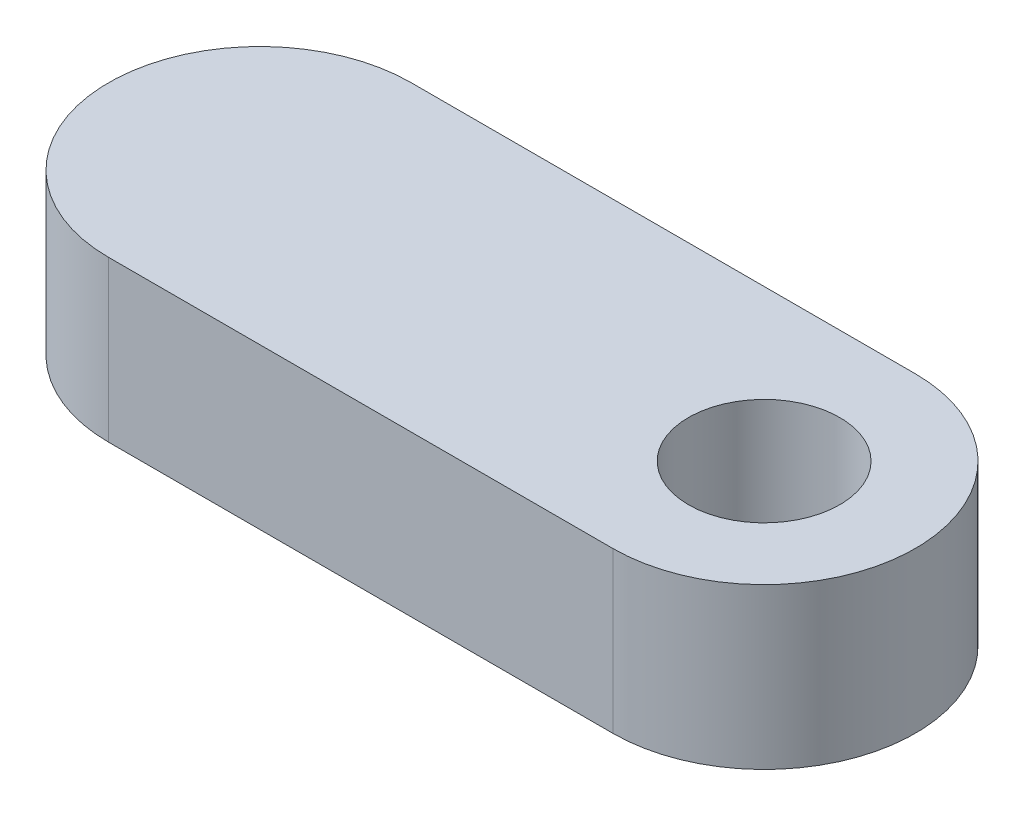
ISO-10303-21;
HEADER;
FILE_DESCRIPTION(('STEP AP214'),'2;1');
FILE_NAME('part.step','',(''),(''),'','','');
FILE_SCHEMA(('AUTOMOTIVE_DESIGN { 1 0 10303 214 1 1 1 1 }'));
ENDSEC;
DATA;
#1=APPLICATION_CONTEXT('core data for automotive mechanical design processes');
#2=APPLICATION_PROTOCOL_DEFINITION('international standard','automotive_design',2000,#1);
#3=PRODUCT_CONTEXT('',#1,'mechanical');
#4=PRODUCT('Part','Part','',(#3));
#5=PRODUCT_RELATED_PRODUCT_CATEGORY('part','',(#4));
#6=PRODUCT_DEFINITION_FORMATION('','',#4);
#7=PRODUCT_DEFINITION_CONTEXT('part definition',#1,'design');
#8=PRODUCT_DEFINITION('design','',#6,#7);
#9=PRODUCT_DEFINITION_SHAPE('','',#8);
#10=(LENGTH_UNIT() NAMED_UNIT(*) SI_UNIT(.MILLI.,.METRE.));
#11=(NAMED_UNIT(*) PLANE_ANGLE_UNIT() SI_UNIT($,.RADIAN.));
#12=(NAMED_UNIT(*) SI_UNIT($,.STERADIAN.) SOLID_ANGLE_UNIT());
#13=UNCERTAINTY_MEASURE_WITH_UNIT(LENGTH_MEASURE(1.E-05),#10,'distance_accuracy_value','');
#14=(GEOMETRIC_REPRESENTATION_CONTEXT(3) GLOBAL_UNCERTAINTY_ASSIGNED_CONTEXT((#13)) GLOBAL_UNIT_ASSIGNED_CONTEXT((#10,
#11,#12)) REPRESENTATION_CONTEXT('',''));
#15=CARTESIAN_POINT('',(0.,0.,0.));
#16=DIRECTION('',(0.,0.,1.));
#17=DIRECTION('',(1.,0.,0.));
#18=AXIS2_PLACEMENT_3D('',#15,#16,#17);
#19=CARTESIAN_POINT('',(-5.,3.175,0.));
#20=DIRECTION('',(0.,1.,0.));
#21=DIRECTION('',(0.,0.,1.));
#22=AXIS2_PLACEMENT_3D('',#19,#20,#21);
#23=PLANE('',#22);
#24=CARTESIAN_POINT('',(-5.,3.175,0.));
#25=DIRECTION('',(0.,1.,0.));
#26=DIRECTION('',(0.,0.,1.));
#27=AXIS2_PLACEMENT_3D('',#24,#25,#26);
#28=CIRCLE('',#27,3.);
#29=CARTESIAN_POINT('',(-5.,3.175,-3.));
#30=VERTEX_POINT('',#29);
#31=CARTESIAN_POINT('',(-5.,3.175,3.));
#32=VERTEX_POINT('',#31);
#33=EDGE_CURVE('E86',#30,#32,#28,.T.);
#34=ORIENTED_EDGE('',*,*,#33,.T.);
#35=DIRECTION('',(1.,0.,0.));
#36=VECTOR('',#35,1.);
#37=CARTESIAN_POINT('',(5.,3.175,3.));
#38=LINE('',#37,#36);
#39=CARTESIAN_POINT('',(5.,3.175,3.));
#40=VERTEX_POINT('',#39);
#41=EDGE_CURVE('E81',#32,#40,#38,.T.);
#42=ORIENTED_EDGE('',*,*,#41,.T.);
#43=CARTESIAN_POINT('',(5.,3.175,0.));
#44=DIRECTION('',(0.,1.,0.));
#45=DIRECTION('',(0.,0.,-1.));
#46=AXIS2_PLACEMENT_3D('',#43,#44,#45);
#47=CIRCLE('',#46,3.);
#48=CARTESIAN_POINT('',(5.,3.175,-3.));
#49=VERTEX_POINT('',#48);
#50=EDGE_CURVE('E84',#40,#49,#47,.T.);
#51=ORIENTED_EDGE('',*,*,#50,.T.);
#52=DIRECTION('',(-1.,0.,0.));
#53=VECTOR('',#52,1.);
#54=CARTESIAN_POINT('',(-5.,3.175,-3.));
#55=LINE('',#54,#53);
#56=EDGE_CURVE('E51',#49,#30,#55,.T.);
#57=ORIENTED_EDGE('',*,*,#56,.T.);
#58=EDGE_LOOP('',(#34,#42,#51,#57));
#59=FACE_BOUND('',#58,.T.);
#60=CARTESIAN_POINT('',(5.,3.175,0.));
#61=DIRECTION('',(0.,1.,0.));
#62=DIRECTION('',(0.,0.,1.));
#63=AXIS2_PLACEMENT_3D('',#60,#61,#62);
#64=CIRCLE('',#63,1.5);
#65=CARTESIAN_POINT('',(5.,3.175,1.5));
#66=VERTEX_POINT('',#65);
#67=EDGE_CURVE('E101',#66,#66,#64,.T.);
#68=ORIENTED_EDGE('',*,*,#67,.F.);
#69=EDGE_LOOP('',(#68));
#70=FACE_BOUND('',#69,.T.);
#71=ADVANCED_FACE('F34',(#59,#70),#23,.T.);
#72=CARTESIAN_POINT('',(-5.,0.,0.));
#73=DIRECTION('',(0.,1.,0.));
#74=DIRECTION('',(0.,0.,1.));
#75=AXIS2_PLACEMENT_3D('',#72,#73,#74);
#76=PLANE('',#75);
#77=CARTESIAN_POINT('',(-5.,0.,0.));
#78=DIRECTION('',(0.,1.,0.));
#79=DIRECTION('',(0.,0.,1.));
#80=AXIS2_PLACEMENT_3D('',#77,#78,#79);
#81=CIRCLE('',#80,3.);
#82=CARTESIAN_POINT('',(-5.,0.,-3.));
#83=VERTEX_POINT('',#82);
#84=CARTESIAN_POINT('',(-5.,0.,3.));
#85=VERTEX_POINT('',#84);
#86=EDGE_CURVE('E98',#83,#85,#81,.T.);
#87=ORIENTED_EDGE('',*,*,#86,.F.);
#88=DIRECTION('',(-1.,0.,0.));
#89=VECTOR('',#88,1.);
#90=CARTESIAN_POINT('',(-5.,0.,-3.));
#91=LINE('',#90,#89);
#92=CARTESIAN_POINT('',(5.,0.,-3.));
#93=VERTEX_POINT('',#92);
#94=EDGE_CURVE('E74',#93,#83,#91,.T.);
#95=ORIENTED_EDGE('',*,*,#94,.F.);
#96=CARTESIAN_POINT('',(5.,0.,0.));
#97=DIRECTION('',(0.,1.,0.));
#98=DIRECTION('',(0.,0.,-1.));
#99=AXIS2_PLACEMENT_3D('',#96,#97,#98);
#100=CIRCLE('',#99,3.);
#101=CARTESIAN_POINT('',(5.,0.,3.));
#102=VERTEX_POINT('',#101);
#103=EDGE_CURVE('E68',#102,#93,#100,.T.);
#104=ORIENTED_EDGE('',*,*,#103,.F.);
#105=DIRECTION('',(1.,0.,0.));
#106=VECTOR('',#105,1.);
#107=CARTESIAN_POINT('',(5.,0.,3.));
#108=LINE('',#107,#106);
#109=EDGE_CURVE('E90',#85,#102,#108,.T.);
#110=ORIENTED_EDGE('',*,*,#109,.F.);
#111=EDGE_LOOP('',(#87,#95,#104,#110));
#112=FACE_BOUND('',#111,.T.);
#113=CARTESIAN_POINT('',(5.,0.,0.));
#114=DIRECTION('',(0.,1.,0.));
#115=DIRECTION('',(0.,0.,1.));
#116=AXIS2_PLACEMENT_3D('',#113,#114,#115);
#117=CIRCLE('',#116,1.5);
#118=CARTESIAN_POINT('',(5.,0.,1.5));
#119=VERTEX_POINT('',#118);
#120=EDGE_CURVE('E113',#119,#119,#117,.T.);
#121=ORIENTED_EDGE('',*,*,#120,.T.);
#122=EDGE_LOOP('',(#121));
#123=FACE_BOUND('',#122,.T.);
#124=ADVANCED_FACE('F109',(#112,#123),#76,.F.);
#125=CARTESIAN_POINT('',(-5.,3.175,0.));
#126=DIRECTION('',(0.,-1.,0.));
#127=DIRECTION('',(0.,0.,-1.));
#128=AXIS2_PLACEMENT_3D('',#125,#126,#127);
#129=CYLINDRICAL_SURFACE('',#128,3.);
#130=ORIENTED_EDGE('',*,*,#86,.T.);
#131=DIRECTION('',(0.,-1.,0.));
#132=VECTOR('',#131,1.);
#133=CARTESIAN_POINT('',(-5.,3.175,3.));
#134=LINE('',#133,#132);
#135=EDGE_CURVE('E11',#32,#85,#134,.T.);
#136=ORIENTED_EDGE('',*,*,#135,.F.);
#137=ORIENTED_EDGE('',*,*,#33,.F.);
#138=DIRECTION('',(0.,-1.,0.));
#139=VECTOR('',#138,1.);
#140=CARTESIAN_POINT('',(-5.,3.175,-3.));
#141=LINE('',#140,#139);
#142=EDGE_CURVE('E94',#30,#83,#141,.T.);
#143=ORIENTED_EDGE('',*,*,#142,.T.);
#144=EDGE_LOOP('',(#130,#136,#137,#143));
#145=FACE_BOUND('',#144,.T.);
#146=ADVANCED_FACE('F36',(#145),#129,.T.);
#147=CARTESIAN_POINT('',(5.,3.175,3.));
#148=DIRECTION('',(0.,0.,-1.));
#149=DIRECTION('',(-1.,0.,0.));
#150=AXIS2_PLACEMENT_3D('',#147,#148,#149);
#151=PLANE('',#150);
#152=ORIENTED_EDGE('',*,*,#109,.T.);
#153=DIRECTION('',(0.,-1.,0.));
#154=VECTOR('',#153,1.);
#155=CARTESIAN_POINT('',(5.,3.175,3.));
#156=LINE('',#155,#154);
#157=EDGE_CURVE('E43',#40,#102,#156,.T.);
#158=ORIENTED_EDGE('',*,*,#157,.F.);
#159=ORIENTED_EDGE('',*,*,#41,.F.);
#160=ORIENTED_EDGE('',*,*,#135,.T.);
#161=EDGE_LOOP('',(#152,#158,#159,#160));
#162=FACE_BOUND('',#161,.T.);
#163=ADVANCED_FACE('F89',(#162),#151,.F.);
#164=CARTESIAN_POINT('',(5.,3.175,0.));
#165=DIRECTION('',(0.,-1.,0.));
#166=DIRECTION('',(0.,0.,-1.));
#167=AXIS2_PLACEMENT_3D('',#164,#165,#166);
#168=CYLINDRICAL_SURFACE('',#167,3.);
#169=ORIENTED_EDGE('',*,*,#103,.T.);
#170=DIRECTION('',(0.,-1.,0.));
#171=VECTOR('',#170,1.);
#172=CARTESIAN_POINT('',(5.,3.175,-3.));
#173=LINE('',#172,#171);
#174=EDGE_CURVE('E91',#49,#93,#173,.T.);
#175=ORIENTED_EDGE('',*,*,#174,.F.);
#176=ORIENTED_EDGE('',*,*,#50,.F.);
#177=ORIENTED_EDGE('',*,*,#157,.T.);
#178=EDGE_LOOP('',(#169,#175,#176,#177));
#179=FACE_BOUND('',#178,.T.);
#180=ADVANCED_FACE('F92',(#179),#168,.T.);
#181=CARTESIAN_POINT('',(-5.,3.175,-3.));
#182=DIRECTION('',(0.,0.,1.));
#183=DIRECTION('',(1.,0.,0.));
#184=AXIS2_PLACEMENT_3D('',#181,#182,#183);
#185=PLANE('',#184);
#186=ORIENTED_EDGE('',*,*,#94,.T.);
#187=ORIENTED_EDGE('',*,*,#142,.F.);
#188=ORIENTED_EDGE('',*,*,#56,.F.);
#189=ORIENTED_EDGE('',*,*,#174,.T.);
#190=EDGE_LOOP('',(#186,#187,#188,#189));
#191=FACE_BOUND('',#190,.T.);
#192=ADVANCED_FACE('F106',(#191),#185,.F.);
#193=CARTESIAN_POINT('',(5.,3.175,0.));
#194=DIRECTION('',(0.,-1.,0.));
#195=DIRECTION('',(0.,0.,-1.));
#196=AXIS2_PLACEMENT_3D('',#193,#194,#195);
#197=CYLINDRICAL_SURFACE('',#196,1.5);
#198=ORIENTED_EDGE('',*,*,#67,.T.);
#199=EDGE_LOOP('',(#198));
#200=FACE_BOUND('',#199,.T.);
#201=ORIENTED_EDGE('',*,*,#120,.F.);
#202=EDGE_LOOP('',(#201));
#203=FACE_BOUND('',#202,.T.);
#204=ADVANCED_FACE('F119',(#200,#203),#197,.F.);
#205=CLOSED_SHELL('',(#71,#124,#146,#163,#180,#192,#204));
#206=MANIFOLD_SOLID_BREP('B2',#205);
#207=ADVANCED_BREP_SHAPE_REPRESENTATION('',(#18,#206),#14);
#208=SHAPE_DEFINITION_REPRESENTATION(#9,#207);
ENDSEC;
END-ISO-10303-21;
